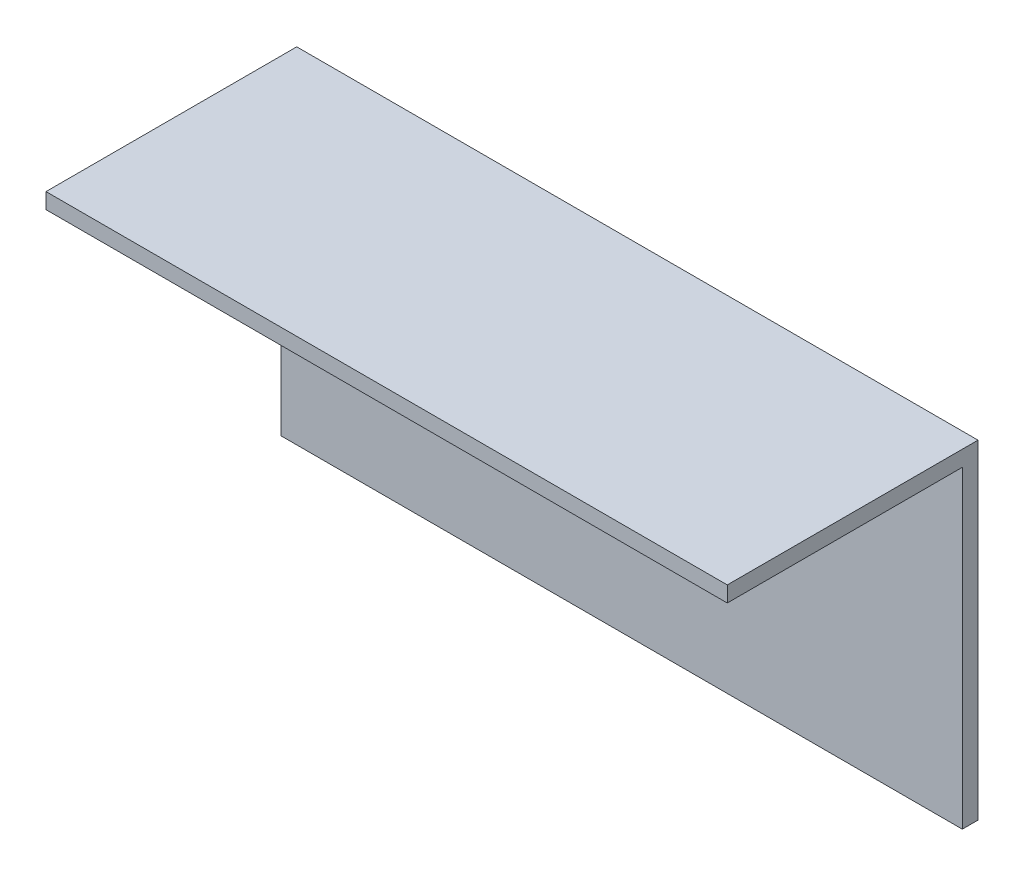
ISO-10303-21;
HEADER;
FILE_DESCRIPTION(('STEP AP214'),'2;1');
FILE_NAME('part.step','',(''),(''),'','','');
FILE_SCHEMA(('AUTOMOTIVE_DESIGN { 1 0 10303 214 1 1 1 1 }'));
ENDSEC;
DATA;
#1=APPLICATION_CONTEXT('core data for automotive mechanical design processes');
#2=APPLICATION_PROTOCOL_DEFINITION('international standard','automotive_design',2000,#1);
#3=PRODUCT_CONTEXT('',#1,'mechanical');
#4=PRODUCT('Part','Part','',(#3));
#5=PRODUCT_RELATED_PRODUCT_CATEGORY('part','',(#4));
#6=PRODUCT_DEFINITION_FORMATION('','',#4);
#7=PRODUCT_DEFINITION_CONTEXT('part definition',#1,'design');
#8=PRODUCT_DEFINITION('design','',#6,#7);
#9=PRODUCT_DEFINITION_SHAPE('','',#8);
#10=(LENGTH_UNIT() NAMED_UNIT(*) SI_UNIT(.MILLI.,.METRE.));
#11=(NAMED_UNIT(*) PLANE_ANGLE_UNIT() SI_UNIT($,.RADIAN.));
#12=(NAMED_UNIT(*) SI_UNIT($,.STERADIAN.) SOLID_ANGLE_UNIT());
#13=UNCERTAINTY_MEASURE_WITH_UNIT(LENGTH_MEASURE(1.E-05),#10,'distance_accuracy_value','');
#14=(GEOMETRIC_REPRESENTATION_CONTEXT(3) GLOBAL_UNCERTAINTY_ASSIGNED_CONTEXT((#13)) GLOBAL_UNIT_ASSIGNED_CONTEXT((#10,
#11,#12)) REPRESENTATION_CONTEXT('',''));
#15=CARTESIAN_POINT('',(0.,0.,0.));
#16=DIRECTION('',(0.,0.,1.));
#17=DIRECTION('',(1.,0.,0.));
#18=AXIS2_PLACEMENT_3D('',#15,#16,#17);
#19=CARTESIAN_POINT('',(0.,0.,10.));
#20=DIRECTION('',(0.,0.,-1.));
#21=DIRECTION('',(-1.,0.,0.));
#22=AXIS2_PLACEMENT_3D('',#19,#20,#21);
#23=PLANE('',#22);
#24=DIRECTION('',(1.,0.,0.));
#25=VECTOR('',#24,1.);
#26=CARTESIAN_POINT('',(-217.37,95.,10.));
#27=LINE('',#26,#25);
#28=CARTESIAN_POINT('',(-217.37,95.,10.));
#29=VERTEX_POINT('',#28);
#30=CARTESIAN_POINT('',(217.37,95.,10.));
#31=VERTEX_POINT('',#30);
#32=EDGE_CURVE('E53',#29,#31,#27,.T.);
#33=ORIENTED_EDGE('',*,*,#32,.F.);
#34=DIRECTION('',(0.,-1.,0.));
#35=VECTOR('',#34,1.);
#36=CARTESIAN_POINT('',(-217.37,-105.,10.));
#37=LINE('',#36,#35);
#38=CARTESIAN_POINT('',(-217.37,-105.,10.));
#39=VERTEX_POINT('',#38);
#40=EDGE_CURVE('E137',#29,#39,#37,.T.);
#41=ORIENTED_EDGE('',*,*,#40,.T.);
#42=DIRECTION('',(1.,0.,0.));
#43=VECTOR('',#42,1.);
#44=CARTESIAN_POINT('',(-217.37,-105.,10.));
#45=LINE('',#44,#43);
#46=CARTESIAN_POINT('',(217.37,-105.,10.));
#47=VERTEX_POINT('',#46);
#48=EDGE_CURVE('E58',#39,#47,#45,.T.);
#49=ORIENTED_EDGE('',*,*,#48,.T.);
#50=DIRECTION('',(0.,1.,0.));
#51=VECTOR('',#50,1.);
#52=CARTESIAN_POINT('',(217.37,-105.,10.));
#53=LINE('',#52,#51);
#54=EDGE_CURVE('E87',#47,#31,#53,.T.);
#55=ORIENTED_EDGE('',*,*,#54,.T.);
#56=EDGE_LOOP('',(#33,#41,#49,#55));
#57=FACE_BOUND('',#56,.T.);
#58=ADVANCED_FACE('F39',(#57),#23,.F.);
#59=CARTESIAN_POINT('',(217.37,-105.,10.));
#60=DIRECTION('',(-1.,0.,0.));
#61=DIRECTION('',(0.,0.,1.));
#62=AXIS2_PLACEMENT_3D('',#59,#60,#61);
#63=PLANE('',#62);
#64=DIRECTION('',(0.,1.,0.));
#65=VECTOR('',#64,1.);
#66=CARTESIAN_POINT('',(217.37,-105.,0.));
#67=LINE('',#66,#65);
#68=CARTESIAN_POINT('',(217.37,-105.,0.));
#69=VERTEX_POINT('',#68);
#70=CARTESIAN_POINT('',(217.37,105.,0.));
#71=VERTEX_POINT('',#70);
#72=EDGE_CURVE('E94',#69,#71,#67,.T.);
#73=ORIENTED_EDGE('',*,*,#72,.T.);
#74=DIRECTION('',(0.,0.,-1.));
#75=VECTOR('',#74,1.);
#76=CARTESIAN_POINT('',(217.37,105.,10.));
#77=LINE('',#76,#75);
#78=CARTESIAN_POINT('',(217.37,105.,160.));
#79=VERTEX_POINT('',#78);
#80=EDGE_CURVE('E11',#79,#71,#77,.T.);
#81=ORIENTED_EDGE('',*,*,#80,.F.);
#82=DIRECTION('',(0.,1.,0.));
#83=VECTOR('',#82,1.);
#84=CARTESIAN_POINT('',(217.37,105.,160.));
#85=LINE('',#84,#83);
#86=CARTESIAN_POINT('',(217.37,95.,160.));
#87=VERTEX_POINT('',#86);
#88=EDGE_CURVE('E131',#87,#79,#85,.T.);
#89=ORIENTED_EDGE('',*,*,#88,.F.);
#90=DIRECTION('',(0.,0.,-1.));
#91=VECTOR('',#90,1.);
#92=CARTESIAN_POINT('',(217.37,95.,160.));
#93=LINE('',#92,#91);
#94=EDGE_CURVE('E101',#87,#31,#93,.T.);
#95=ORIENTED_EDGE('',*,*,#94,.T.);
#96=ORIENTED_EDGE('',*,*,#54,.F.);
#97=DIRECTION('',(0.,0.,-1.));
#98=VECTOR('',#97,1.);
#99=CARTESIAN_POINT('',(217.37,-105.,10.));
#100=LINE('',#99,#98);
#101=EDGE_CURVE('E85',#47,#69,#100,.T.);
#102=ORIENTED_EDGE('',*,*,#101,.T.);
#103=EDGE_LOOP('',(#73,#81,#89,#95,#96,#102));
#104=FACE_BOUND('',#103,.T.);
#105=ADVANCED_FACE('F41',(#104),#63,.F.);
#106=CARTESIAN_POINT('',(-217.37,105.,10.));
#107=DIRECTION('',(0.,-1.,0.));
#108=DIRECTION('',(0.,0.,-1.));
#109=AXIS2_PLACEMENT_3D('',#106,#107,#108);
#110=PLANE('',#109);
#111=DIRECTION('',(-1.,0.,0.));
#112=VECTOR('',#111,1.);
#113=CARTESIAN_POINT('',(-217.37,105.,0.));
#114=LINE('',#113,#112);
#115=CARTESIAN_POINT('',(-217.37,105.,0.));
#116=VERTEX_POINT('',#115);
#117=EDGE_CURVE('E98',#71,#116,#114,.T.);
#118=ORIENTED_EDGE('',*,*,#117,.T.);
#119=DIRECTION('',(0.,0.,-1.));
#120=VECTOR('',#119,1.);
#121=CARTESIAN_POINT('',(-217.37,105.,10.));
#122=LINE('',#121,#120);
#123=CARTESIAN_POINT('',(-217.37,105.,160.));
#124=VERTEX_POINT('',#123);
#125=EDGE_CURVE('E50',#124,#116,#122,.T.);
#126=ORIENTED_EDGE('',*,*,#125,.F.);
#127=DIRECTION('',(-1.,0.,0.));
#128=VECTOR('',#127,1.);
#129=CARTESIAN_POINT('',(-217.37,105.,160.));
#130=LINE('',#129,#128);
#131=EDGE_CURVE('E121',#79,#124,#130,.T.);
#132=ORIENTED_EDGE('',*,*,#131,.F.);
#133=ORIENTED_EDGE('',*,*,#80,.T.);
#134=EDGE_LOOP('',(#118,#126,#132,#133));
#135=FACE_BOUND('',#134,.T.);
#136=ADVANCED_FACE('F123',(#135),#110,.F.);
#137=CARTESIAN_POINT('',(-217.37,-105.,10.));
#138=DIRECTION('',(1.,0.,0.));
#139=DIRECTION('',(0.,0.,-1.));
#140=AXIS2_PLACEMENT_3D('',#137,#138,#139);
#141=PLANE('',#140);
#142=DIRECTION('',(0.,-1.,0.));
#143=VECTOR('',#142,1.);
#144=CARTESIAN_POINT('',(-217.37,-105.,0.));
#145=LINE('',#144,#143);
#146=CARTESIAN_POINT('',(-217.37,-105.,0.));
#147=VERTEX_POINT('',#146);
#148=EDGE_CURVE('E89',#116,#147,#145,.T.);
#149=ORIENTED_EDGE('',*,*,#148,.T.);
#150=DIRECTION('',(0.,0.,-1.));
#151=VECTOR('',#150,1.);
#152=CARTESIAN_POINT('',(-217.37,-105.,10.));
#153=LINE('',#152,#151);
#154=EDGE_CURVE('E82',#39,#147,#153,.T.);
#155=ORIENTED_EDGE('',*,*,#154,.F.);
#156=ORIENTED_EDGE('',*,*,#40,.F.);
#157=DIRECTION('',(0.,0.,-1.));
#158=VECTOR('',#157,1.);
#159=CARTESIAN_POINT('',(-217.37,95.,160.));
#160=LINE('',#159,#158);
#161=CARTESIAN_POINT('',(-217.37,95.,160.));
#162=VERTEX_POINT('',#161);
#163=EDGE_CURVE('E99',#162,#29,#160,.T.);
#164=ORIENTED_EDGE('',*,*,#163,.F.);
#165=DIRECTION('',(0.,-1.,0.));
#166=VECTOR('',#165,1.);
#167=CARTESIAN_POINT('',(-217.37,105.,160.));
#168=LINE('',#167,#166);
#169=EDGE_CURVE('E120',#124,#162,#168,.T.);
#170=ORIENTED_EDGE('',*,*,#169,.F.);
#171=ORIENTED_EDGE('',*,*,#125,.T.);
#172=EDGE_LOOP('',(#149,#155,#156,#164,#170,#171));
#173=FACE_BOUND('',#172,.T.);
#174=ADVANCED_FACE('F114',(#173),#141,.F.);
#175=CARTESIAN_POINT('',(-217.37,-105.,10.));
#176=DIRECTION('',(0.,1.,0.));
#177=DIRECTION('',(0.,0.,1.));
#178=AXIS2_PLACEMENT_3D('',#175,#176,#177);
#179=PLANE('',#178);
#180=DIRECTION('',(1.,0.,0.));
#181=VECTOR('',#180,1.);
#182=CARTESIAN_POINT('',(-217.37,-105.,0.));
#183=LINE('',#182,#181);
#184=EDGE_CURVE('E80',#147,#69,#183,.T.);
#185=ORIENTED_EDGE('',*,*,#184,.T.);
#186=ORIENTED_EDGE('',*,*,#101,.F.);
#187=ORIENTED_EDGE('',*,*,#48,.F.);
#188=ORIENTED_EDGE('',*,*,#154,.T.);
#189=EDGE_LOOP('',(#185,#186,#187,#188));
#190=FACE_BOUND('',#189,.T.);
#191=ADVANCED_FACE('F83',(#190),#179,.F.);
#192=CARTESIAN_POINT('',(0.,0.,0.));
#193=DIRECTION('',(0.,0.,-1.));
#194=DIRECTION('',(-1.,0.,0.));
#195=AXIS2_PLACEMENT_3D('',#192,#193,#194);
#196=PLANE('',#195);
#197=ORIENTED_EDGE('',*,*,#72,.F.);
#198=ORIENTED_EDGE('',*,*,#184,.F.);
#199=ORIENTED_EDGE('',*,*,#148,.F.);
#200=ORIENTED_EDGE('',*,*,#117,.F.);
#201=EDGE_LOOP('',(#197,#198,#199,#200));
#202=FACE_BOUND('',#201,.T.);
#203=ADVANCED_FACE('F97',(#202),#196,.T.);
#204=CARTESIAN_POINT('',(-217.37,95.,160.));
#205=DIRECTION('',(0.,1.,0.));
#206=DIRECTION('',(0.,0.,1.));
#207=AXIS2_PLACEMENT_3D('',#204,#205,#206);
#208=PLANE('',#207);
#209=ORIENTED_EDGE('',*,*,#32,.T.);
#210=ORIENTED_EDGE('',*,*,#94,.F.);
#211=DIRECTION('',(1.,0.,0.));
#212=VECTOR('',#211,1.);
#213=CARTESIAN_POINT('',(-217.37,95.,160.));
#214=LINE('',#213,#212);
#215=EDGE_CURVE('E132',#162,#87,#214,.T.);
#216=ORIENTED_EDGE('',*,*,#215,.F.);
#217=ORIENTED_EDGE('',*,*,#163,.T.);
#218=EDGE_LOOP('',(#209,#210,#216,#217));
#219=FACE_BOUND('',#218,.T.);
#220=ADVANCED_FACE('F145',(#219),#208,.F.);
#221=CARTESIAN_POINT('',(0.,0.,160.));
#222=DIRECTION('',(0.,0.,1.));
#223=DIRECTION('',(1.,0.,0.));
#224=AXIS2_PLACEMENT_3D('',#221,#222,#223);
#225=PLANE('',#224);
#226=ORIENTED_EDGE('',*,*,#169,.T.);
#227=ORIENTED_EDGE('',*,*,#215,.T.);
#228=ORIENTED_EDGE('',*,*,#88,.T.);
#229=ORIENTED_EDGE('',*,*,#131,.T.);
#230=EDGE_LOOP('',(#226,#227,#228,#229));
#231=FACE_BOUND('',#230,.T.);
#232=ADVANCED_FACE('F130',(#231),#225,.T.);
#233=CLOSED_SHELL('',(#58,#105,#136,#174,#191,#203,#220,#232));
#234=MANIFOLD_SOLID_BREP('B2',#233);
#235=ADVANCED_BREP_SHAPE_REPRESENTATION('',(#18,#234),#14);
#236=SHAPE_DEFINITION_REPRESENTATION(#9,#235);
ENDSEC;
END-ISO-10303-21;
